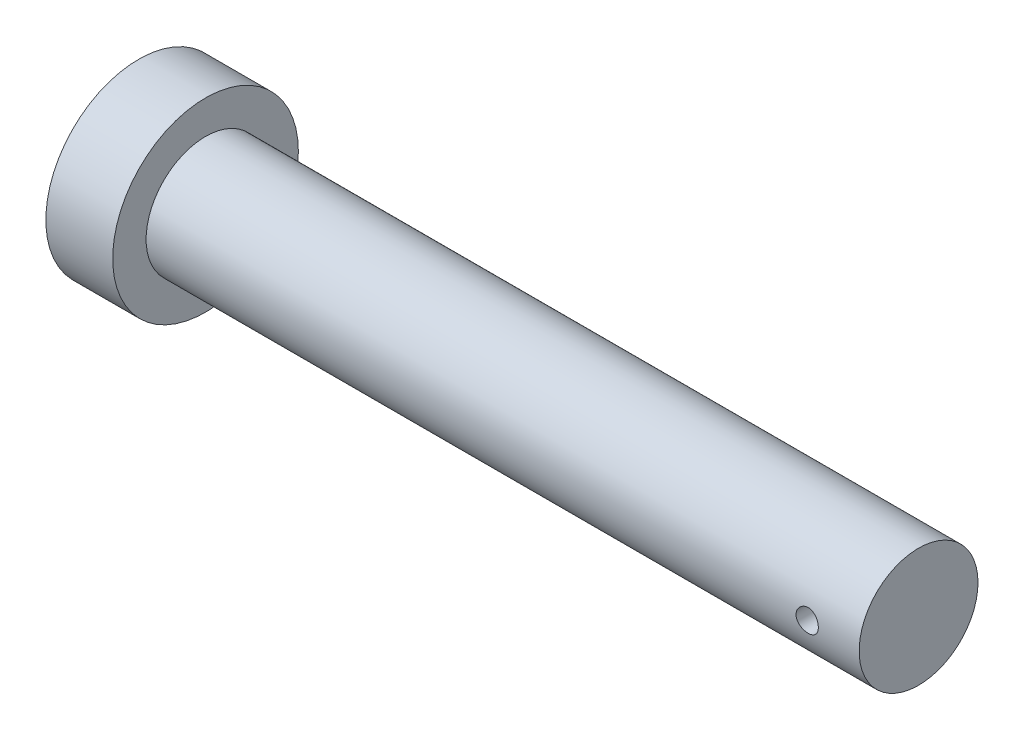
ISO-10303-21;
HEADER;
FILE_DESCRIPTION(('STEP AP214'),'2;1');
FILE_NAME('part.step','',(''),(''),'','','');
FILE_SCHEMA(('AUTOMOTIVE_DESIGN { 1 0 10303 214 1 1 1 1 }'));
ENDSEC;
DATA;
#1=APPLICATION_CONTEXT('core data for automotive mechanical design processes');
#2=APPLICATION_PROTOCOL_DEFINITION('international standard','automotive_design',2000,#1);
#3=PRODUCT_CONTEXT('',#1,'mechanical');
#4=PRODUCT('Part','Part','',(#3));
#5=PRODUCT_RELATED_PRODUCT_CATEGORY('part','',(#4));
#6=PRODUCT_DEFINITION_FORMATION('','',#4);
#7=PRODUCT_DEFINITION_CONTEXT('part definition',#1,'design');
#8=PRODUCT_DEFINITION('design','',#6,#7);
#9=PRODUCT_DEFINITION_SHAPE('','',#8);
#10=(LENGTH_UNIT() NAMED_UNIT(*) SI_UNIT(.MILLI.,.METRE.));
#11=(NAMED_UNIT(*) PLANE_ANGLE_UNIT() SI_UNIT($,.RADIAN.));
#12=(NAMED_UNIT(*) SI_UNIT($,.STERADIAN.) SOLID_ANGLE_UNIT());
#13=UNCERTAINTY_MEASURE_WITH_UNIT(LENGTH_MEASURE(1.E-05),#10,'distance_accuracy_value','');
#14=(GEOMETRIC_REPRESENTATION_CONTEXT(3) GLOBAL_UNCERTAINTY_ASSIGNED_CONTEXT((#13)) GLOBAL_UNIT_ASSIGNED_CONTEXT((#10,
#11,#12)) REPRESENTATION_CONTEXT('',''));
#15=CARTESIAN_POINT('',(0.,0.,0.));
#16=DIRECTION('',(0.,0.,1.));
#17=DIRECTION('',(1.,0.,0.));
#18=AXIS2_PLACEMENT_3D('',#15,#16,#17);
#19=CARTESIAN_POINT('',(9.,0.,0.));
#20=DIRECTION('',(1.,0.,0.));
#21=DIRECTION('',(0.,0.,-1.));
#22=AXIS2_PLACEMENT_3D('',#19,#20,#21);
#23=PLANE('',#22);
#24=CARTESIAN_POINT('',(9.,0.,0.));
#25=DIRECTION('',(1.,0.,0.));
#26=DIRECTION('',(0.,0.,-1.));
#27=AXIS2_PLACEMENT_3D('',#24,#25,#26);
#28=CIRCLE('',#27,12.5);
#29=CARTESIAN_POINT('',(9.,0.,-12.5));
#30=VERTEX_POINT('',#29);
#31=EDGE_CURVE('E48',#30,#30,#28,.T.);
#32=ORIENTED_EDGE('',*,*,#31,.T.);
#33=EDGE_LOOP('',(#32));
#34=FACE_BOUND('',#33,.T.);
#35=CARTESIAN_POINT('',(9.,0.,0.));
#36=DIRECTION('',(1.,0.,0.));
#37=DIRECTION('',(0.,0.,-1.));
#38=AXIS2_PLACEMENT_3D('',#35,#36,#37);
#39=CIRCLE('',#38,8.);
#40=CARTESIAN_POINT('',(9.,0.,-8.));
#41=VERTEX_POINT('',#40);
#42=EDGE_CURVE('E91',#41,#41,#39,.T.);
#43=ORIENTED_EDGE('',*,*,#42,.F.);
#44=EDGE_LOOP('',(#43));
#45=FACE_BOUND('',#44,.T.);
#46=ADVANCED_FACE('F35',(#34,#45),#23,.T.);
#47=CARTESIAN_POINT('',(9.,0.,0.));
#48=DIRECTION('',(-1.,0.,0.));
#49=DIRECTION('',(0.,0.,1.));
#50=AXIS2_PLACEMENT_3D('',#47,#48,#49);
#51=CYLINDRICAL_SURFACE('',#50,12.5);
#52=ORIENTED_EDGE('',*,*,#31,.F.);
#53=EDGE_LOOP('',(#52));
#54=FACE_BOUND('',#53,.T.);
#55=CARTESIAN_POINT('',(0.,0.,0.));
#56=DIRECTION('',(1.,0.,0.));
#57=DIRECTION('',(0.,0.,-1.));
#58=AXIS2_PLACEMENT_3D('',#55,#56,#57);
#59=CIRCLE('',#58,12.5);
#60=CARTESIAN_POINT('',(0.,0.,-12.5));
#61=VERTEX_POINT('',#60);
#62=EDGE_CURVE('E52',#61,#61,#59,.T.);
#63=ORIENTED_EDGE('',*,*,#62,.T.);
#64=EDGE_LOOP('',(#63));
#65=FACE_BOUND('',#64,.T.);
#66=ADVANCED_FACE('F37',(#54,#65),#51,.T.);
#67=CARTESIAN_POINT('',(0.,0.,0.));
#68=DIRECTION('',(1.,0.,0.));
#69=DIRECTION('',(0.,0.,-1.));
#70=AXIS2_PLACEMENT_3D('',#67,#68,#69);
#71=PLANE('',#70);
#72=ORIENTED_EDGE('',*,*,#62,.F.);
#73=EDGE_LOOP('',(#72));
#74=FACE_BOUND('',#73,.T.);
#75=ADVANCED_FACE('F73',(#74),#71,.F.);
#76=CARTESIAN_POINT('',(105.,0.,0.));
#77=DIRECTION('',(-1.,0.,0.));
#78=DIRECTION('',(0.,0.,1.));
#79=AXIS2_PLACEMENT_3D('',#76,#77,#78);
#80=CYLINDRICAL_SURFACE('',#79,8.);
#81=CARTESIAN_POINT('',(99.5,0.,-8.));
#82=CARTESIAN_POINT('',(99.4999968104117,0.0834717464654716,-7.99999848833852));
#83=CARTESIAN_POINT('',(99.4930089233806,0.1669849927301,-7.99868009921714));
#84=CARTESIAN_POINT('',(99.4652600048816,0.331658129841799,-7.9935478589052));
#85=CARTESIAN_POINT('',(99.4444873493602,0.412815974152226,-7.98973190166897));
#86=CARTESIAN_POINT('',(99.3898272987407,0.570372961851804,-7.98003138765458));
#87=CARTESIAN_POINT('',(99.3559517475475,0.646776330685349,-7.97414869946483));
#88=CARTESIAN_POINT('',(99.2760811230772,0.792807973094011,-7.96095710599783));
#89=CARTESIAN_POINT('',(99.2300870308552,0.862436794477324,-7.9536483161829));
#90=CARTESIAN_POINT('',(99.1267002319963,0.9937837159305,-7.93831336430504));
#91=CARTESIAN_POINT('',(99.0691905553299,1.05540895503183,-7.93028034856351));
#92=CARTESIAN_POINT('',(98.9446566909124,1.16819606135369,-7.9144531845865));
#93=CARTESIAN_POINT('',(98.8776318202307,1.21935717689241,-7.90665905354528));
#94=CARTESIAN_POINT('',(98.735313911636,1.31014998665793,-7.89212551245006));
#95=CARTESIAN_POINT('',(98.6599596296828,1.34968721969605,-7.88539493886182));
#96=CARTESIAN_POINT('',(98.5035310848232,1.41550524332283,-7.87384713211987));
#97=CARTESIAN_POINT('',(98.4224573158888,1.44178717713098,-7.86902973396962));
#98=CARTESIAN_POINT('',(98.2578847690856,1.480050535035,-7.8619226957455));
#99=CARTESIAN_POINT('',(98.1744249027965,1.49219390192039,-7.85960445366405));
#100=CARTESIAN_POINT('',(98.0066226151917,1.50233808095346,-7.85767197152761));
#101=CARTESIAN_POINT('',(97.9222802736977,1.50034016135374,-7.8580574889876));
#102=CARTESIAN_POINT('',(97.7562804747339,1.48238979602362,-7.86146292701753));
#103=CARTESIAN_POINT('',(97.6746022856998,1.46662149996045,-7.86444808147334));
#104=CARTESIAN_POINT('',(97.5150715802174,1.42186799396206,-7.87266183284666));
#105=CARTESIAN_POINT('',(97.4372192264907,1.39288222239499,-7.87789052509516));
#106=CARTESIAN_POINT('',(97.2870113209997,1.32233647179299,-7.89003855292589));
#107=CARTESIAN_POINT('',(97.2146915294192,1.28070213532455,-7.89696783823366));
#108=CARTESIAN_POINT('',(97.0779952714598,1.18609368930416,-7.91172971602918));
#109=CARTESIAN_POINT('',(97.0136196122852,1.13311842889265,-7.91956240015522));
#110=CARTESIAN_POINT('',(96.8935750443275,1.01633905685297,-7.93540001272164));
#111=CARTESIAN_POINT('',(96.8380593475482,0.952377436860676,-7.94340571024031));
#112=CARTESIAN_POINT('',(96.7385227593246,0.815968037098823,-7.95857386108318));
#113=CARTESIAN_POINT('',(96.6945019831296,0.743520172255769,-7.96573630595245));
#114=CARTESIAN_POINT('',(96.61918224613,0.592034988874669,-7.97842539677509));
#115=CARTESIAN_POINT('',(96.5878992208821,0.512989564446493,-7.98394999136289));
#116=CARTESIAN_POINT('',(96.5390979069078,0.350639115398694,-7.99272505402719));
#117=CARTESIAN_POINT('',(96.5215781559546,0.267334544277783,-7.99597576367994));
#118=CARTESIAN_POINT('',(96.5010139689817,0.100148652903381,-7.99980360641981));
#119=CARTESIAN_POINT('',(96.4977596084703,0.0162940126341309,-8.00041950912279));
#120=CARTESIAN_POINT('',(96.5052554795476,-0.150761248092187,-7.99901543598228));
#121=CARTESIAN_POINT('',(96.5160050230652,-0.233961900480388,-7.99699558964431));
#122=CARTESIAN_POINT('',(96.5510290351833,-0.396681573218219,-7.99057111500406));
#123=CARTESIAN_POINT('',(96.5751972825378,-0.476224261046066,-7.98618522374031));
#124=CARTESIAN_POINT('',(96.6362577067788,-0.630128631824634,-7.97551842212498));
#125=CARTESIAN_POINT('',(96.6731507475658,-0.704489962595103,-7.96923738311334));
#126=CARTESIAN_POINT('',(96.7590781281595,-0.846816671513214,-7.95538030357666));
#127=CARTESIAN_POINT('',(96.8082407385369,-0.914703277015124,-7.94779086174563));
#128=CARTESIAN_POINT('',(96.9171381373624,-1.04133832326455,-7.93219343489712));
#129=CARTESIAN_POINT('',(96.9768739130013,-1.10008590976087,-7.92418541084687));
#130=CARTESIAN_POINT('',(97.1061723189114,-1.20757295872048,-7.9085247569745));
#131=CARTESIAN_POINT('',(97.1758549081254,-1.25616916218577,-7.90087825860257));
#132=CARTESIAN_POINT('',(97.3225176245238,-1.34096675057787,-7.88692985578532));
#133=CARTESIAN_POINT('',(97.3994974803705,-1.37716859613924,-7.8806279013735));
#134=CARTESIAN_POINT('',(97.5582058672425,-1.43594673512823,-7.87013024209574));
#135=CARTESIAN_POINT('',(97.6399093795593,-1.45858868794786,-7.86592440436878));
#136=CARTESIAN_POINT('',(97.8060472225214,-1.48980679326235,-7.86007203802415));
#137=CARTESIAN_POINT('',(97.8904812439704,-1.49838453270708,-7.8584252206579));
#138=CARTESIAN_POINT('',(98.0582483314415,-1.50117762148354,-7.85789199803857));
#139=CARTESIAN_POINT('',(98.141577580957,-1.49561895003499,-7.85896215974293));
#140=CARTESIAN_POINT('',(98.3060914220453,-1.47079175378803,-7.86364600659998));
#141=CARTESIAN_POINT('',(98.3872760264274,-1.45152331089332,-7.86725967655747));
#142=CARTESIAN_POINT('',(98.5450744847955,-1.39991887583263,-7.8766050802318));
#143=CARTESIAN_POINT('',(98.6216965913457,-1.36760735397253,-7.88233284594965));
#144=CARTESIAN_POINT('',(98.7684682542408,-1.29085868912205,-7.8952638755184));
#145=CARTESIAN_POINT('',(98.8386173528448,-1.24642068948186,-7.90246724360119));
#146=CARTESIAN_POINT('',(98.9715836800423,-1.14589487339536,-7.91767266107745));
#147=CARTESIAN_POINT('',(99.0342754125671,-1.08964259864304,-7.92568505353043));
#148=CARTESIAN_POINT('',(99.1494051624645,-0.967427926742292,-7.94152833918735));
#149=CARTESIAN_POINT('',(99.2018408209801,-0.901463301891618,-7.94935919027328));
#150=CARTESIAN_POINT('',(99.2954109526271,-0.760984945071875,-7.96403975968049));
#151=CARTESIAN_POINT('',(99.3364394284906,-0.686399590640519,-7.97088000990561));
#152=CARTESIAN_POINT('',(99.4053176366051,-0.531290113653837,-7.98271619380687));
#153=CARTESIAN_POINT('',(99.4331797470469,-0.450771651705251,-7.98771385879037));
#154=CARTESIAN_POINT('',(99.4692773144187,-0.308347202825156,-7.99428290707632));
#155=CARTESIAN_POINT('',(99.4807786303128,-0.247273810251872,-7.99641470878206));
#156=CARTESIAN_POINT('',(99.4961410621164,-0.124141247115158,-7.9992737995401));
#157=CARTESIAN_POINT('',(99.5000023722559,-0.0620821016527094,-8.00000112429805));
#158=CARTESIAN_POINT('',(99.5,0.,-8.));
#159=B_SPLINE_CURVE_WITH_KNOTS('',3,(#81,#82,#83,#84,#85,#86,#87,#88,#89,#90,#91,#92,#93,#94,
#95,#96,#97,#98,#99,#100,#101,#102,#103,#104,#105,#106,#107,#108,#109,#110,#111,#112,#113,#114,
#115,#116,#117,#118,#119,#120,#121,#122,#123,#124,#125,#126,#127,#128,#129,#130,#131,#132,#133,
#134,#135,#136,#137,#138,#139,#140,#141,#142,#143,#144,#145,#146,#147,#148,#149,#150,#151,#152,
#153,#154,#155,#156,#157,#158),.UNSPECIFIED.,.T.,.F.,(4,2,2,2,2,2,2,2,2,2,2,2,2,2,2,2,2,2,2,2,2,
2,2,2,2,2,2,2,2,2,2,2,2,2,2,2,2,2,4),(0.,0.250188200964927,0.500587642535452,0.750761271230911,
1.00091465336891,1.2537511801363,1.50660586283616,1.76146190504357,2.01629596311948,
2.26818151445335,2.52004447587256,2.76859000612766,3.01714609846786,3.2671926262953,
3.5172645404986,3.77127768464076,4.02529337544947,4.27962588321698,4.53393136673745,
4.78448174076096,5.03501980464583,5.28360233907828,5.53220175338031,5.78351778017709,
6.03485728413098,6.28953436987299,6.54420198954945,6.79762627818559,7.05102196946512,
7.30039252231747,7.54976158541505,7.7986649620769,8.0475859265542,8.30023369966378,
8.55293951262253,8.80792048916312,9.06266126931171,9.24874344524407,9.43482089039539),.UNSPECIFIED.);
#160=CARTESIAN_POINT('',(99.5,0.,-8.));
#161=VERTEX_POINT('',#160);
#162=EDGE_CURVE('E39',#161,#161,#159,.T.);
#163=ORIENTED_EDGE('',*,*,#162,.T.);
#164=EDGE_LOOP('',(#163));
#165=FACE_BOUND('',#164,.T.);
#166=CARTESIAN_POINT('',(99.5,0.,8.00000000000001));
#167=CARTESIAN_POINT('',(99.4999968104117,-0.0834717464654715,7.99999848833853));
#168=CARTESIAN_POINT('',(99.4930089233806,-0.1669849927301,7.99868009921715));
#169=CARTESIAN_POINT('',(99.4652600048816,-0.331658129841799,7.9935478589052));
#170=CARTESIAN_POINT('',(99.4444873493602,-0.412815974152226,7.98973190166897));
#171=CARTESIAN_POINT('',(99.3898272987407,-0.570372961851804,7.98003138765458));
#172=CARTESIAN_POINT('',(99.3559517475475,-0.646776330685349,7.97414869946483));
#173=CARTESIAN_POINT('',(99.2760811230772,-0.792807973094011,7.96095710599783));
#174=CARTESIAN_POINT('',(99.2300870308552,-0.862436794477324,7.9536483161829));
#175=CARTESIAN_POINT('',(99.1267002319963,-0.993783715930499,7.93831336430504));
#176=CARTESIAN_POINT('',(99.0691905553299,-1.05540895503183,7.93028034856351));
#177=CARTESIAN_POINT('',(98.9446566909124,-1.16819606135369,7.9144531845865));
#178=CARTESIAN_POINT('',(98.8776318202307,-1.21935717689241,7.90665905354528));
#179=CARTESIAN_POINT('',(98.735313911636,-1.31014998665793,7.89212551245006));
#180=CARTESIAN_POINT('',(98.6599596296828,-1.34968721969605,7.88539493886182));
#181=CARTESIAN_POINT('',(98.5035310848232,-1.41550524332283,7.87384713211987));
#182=CARTESIAN_POINT('',(98.4224573158888,-1.44178717713098,7.86902973396962));
#183=CARTESIAN_POINT('',(98.2578847690856,-1.480050535035,7.8619226957455));
#184=CARTESIAN_POINT('',(98.1744249027965,-1.49219390192039,7.85960445366405));
#185=CARTESIAN_POINT('',(98.0066226151917,-1.50233808095346,7.85767197152761));
#186=CARTESIAN_POINT('',(97.9222802736977,-1.50034016135374,7.8580574889876));
#187=CARTESIAN_POINT('',(97.7562804747339,-1.48238979602362,7.86146292701753));
#188=CARTESIAN_POINT('',(97.6746022856998,-1.46662149996045,7.86444808147334));
#189=CARTESIAN_POINT('',(97.5150715802174,-1.42186799396206,7.87266183284666));
#190=CARTESIAN_POINT('',(97.4372192264907,-1.39288222239499,7.87789052509516));
#191=CARTESIAN_POINT('',(97.2870113209997,-1.32233647179299,7.89003855292589));
#192=CARTESIAN_POINT('',(97.2146915294192,-1.28070213532455,7.89696783823366));
#193=CARTESIAN_POINT('',(97.0779952714598,-1.18609368930416,7.91172971602918));
#194=CARTESIAN_POINT('',(97.0136196122852,-1.13311842889265,7.91956240015522));
#195=CARTESIAN_POINT('',(96.8935750443275,-1.01633905685297,7.93540001272164));
#196=CARTESIAN_POINT('',(96.8380593475482,-0.952377436860676,7.94340571024031));
#197=CARTESIAN_POINT('',(96.7385227593246,-0.815968037098823,7.95857386108318));
#198=CARTESIAN_POINT('',(96.6945019831296,-0.743520172255769,7.96573630595245));
#199=CARTESIAN_POINT('',(96.61918224613,-0.592034988874668,7.97842539677509));
#200=CARTESIAN_POINT('',(96.5878992208821,-0.512989564446493,7.98394999136289));
#201=CARTESIAN_POINT('',(96.5390979069078,-0.350639115398694,7.99272505402719));
#202=CARTESIAN_POINT('',(96.5215781559546,-0.267334544277783,7.99597576367994));
#203=CARTESIAN_POINT('',(96.5010139689817,-0.100148652903381,7.99980360641981));
#204=CARTESIAN_POINT('',(96.4977596084703,-0.0162940126341309,8.00041950912279));
#205=CARTESIAN_POINT('',(96.5052554795476,0.150761248092187,7.99901543598228));
#206=CARTESIAN_POINT('',(96.5160050230652,0.233961900480388,7.99699558964431));
#207=CARTESIAN_POINT('',(96.5510290351833,0.396681573218217,7.99057111500406));
#208=CARTESIAN_POINT('',(96.5751972825378,0.476224261046062,7.98618522374031));
#209=CARTESIAN_POINT('',(96.6362577067788,0.63012863182463,7.97551842212498));
#210=CARTESIAN_POINT('',(96.6731507475658,0.7044899625951,7.96923738311334));
#211=CARTESIAN_POINT('',(96.7590781281595,0.846816671513212,7.95538030357666));
#212=CARTESIAN_POINT('',(96.8082407385368,0.914703277015121,7.94779086174563));
#213=CARTESIAN_POINT('',(96.9171381373623,1.04133832326455,7.93219343489711));
#214=CARTESIAN_POINT('',(96.9768739130013,1.10008590976087,7.92418541084687));
#215=CARTESIAN_POINT('',(97.1061723189114,1.20757295872048,7.9085247569745));
#216=CARTESIAN_POINT('',(97.1758549081254,1.25616916218577,7.90087825860257));
#217=CARTESIAN_POINT('',(97.3225176245238,1.34096675057787,7.88692985578532));
#218=CARTESIAN_POINT('',(97.3994974803705,1.37716859613924,7.8806279013735));
#219=CARTESIAN_POINT('',(97.5582058672425,1.43594673512823,7.87013024209574));
#220=CARTESIAN_POINT('',(97.6399093795593,1.45858868794786,7.86592440436878));
#221=CARTESIAN_POINT('',(97.8060472225214,1.48980679326235,7.86007203802415));
#222=CARTESIAN_POINT('',(97.8904812439704,1.49838453270708,7.8584252206579));
#223=CARTESIAN_POINT('',(98.0582483314415,1.50117762148354,7.85789199803857));
#224=CARTESIAN_POINT('',(98.141577580957,1.49561895003499,7.85896215974293));
#225=CARTESIAN_POINT('',(98.3060914220453,1.47079175378803,7.86364600659998));
#226=CARTESIAN_POINT('',(98.3872760264274,1.45152331089332,7.86725967655747));
#227=CARTESIAN_POINT('',(98.5450744847955,1.39991887583263,7.8766050802318));
#228=CARTESIAN_POINT('',(98.6216965913457,1.36760735397253,7.88233284594965));
#229=CARTESIAN_POINT('',(98.7684682542408,1.29085868912205,7.8952638755184));
#230=CARTESIAN_POINT('',(98.8386173528448,1.24642068948186,7.90246724360119));
#231=CARTESIAN_POINT('',(98.9715836800423,1.14589487339536,7.91767266107745));
#232=CARTESIAN_POINT('',(99.0342754125671,1.08964259864304,7.92568505353043));
#233=CARTESIAN_POINT('',(99.1494051624645,0.967427926742292,7.94152833918735));
#234=CARTESIAN_POINT('',(99.2018408209801,0.901463301891618,7.94935919027328));
#235=CARTESIAN_POINT('',(99.2954109526271,0.760984945071875,7.96403975968049));
#236=CARTESIAN_POINT('',(99.3364394284906,0.686399590640519,7.97088000990561));
#237=CARTESIAN_POINT('',(99.4053176366051,0.531290113653837,7.98271619380687));
#238=CARTESIAN_POINT('',(99.4331797470469,0.450771651705251,7.98771385879037));
#239=CARTESIAN_POINT('',(99.4692773144187,0.308347202825156,7.99428290707632));
#240=CARTESIAN_POINT('',(99.4807786303128,0.247273810251872,7.99641470878206));
#241=CARTESIAN_POINT('',(99.4961410621164,0.124141247115158,7.9992737995401));
#242=CARTESIAN_POINT('',(99.5000023722559,0.0620821016527094,8.00000112429806));
#243=CARTESIAN_POINT('',(99.5,0.,8.00000000000001));
#244=B_SPLINE_CURVE_WITH_KNOTS('',3,(#166,#167,#168,#169,#170,#171,#172,#173,#174,#175,#176,
#177,#178,#179,#180,#181,#182,#183,#184,#185,#186,#187,#188,#189,#190,#191,#192,#193,#194,#195,
#196,#197,#198,#199,#200,#201,#202,#203,#204,#205,#206,#207,#208,#209,#210,#211,#212,#213,#214,
#215,#216,#217,#218,#219,#220,#221,#222,#223,#224,#225,#226,#227,#228,#229,#230,#231,#232,#233,
#234,#235,#236,#237,#238,#239,#240,#241,#242,#243),.UNSPECIFIED.,.T.,.F.,(4,2,2,2,2,2,2,2,2,2,2,
2,2,2,2,2,2,2,2,2,2,2,2,2,2,2,2,2,2,2,2,2,2,2,2,2,2,2,4),(0.,0.250188200964927,
0.500587642535451,0.750761271230911,1.00091465336891,1.2537511801363,1.50660586283616,
1.76146190504357,2.01629596311948,2.26818151445335,2.52004447587256,2.76859000612766,
3.01714609846786,3.2671926262953,3.51726454049859,3.77127768464076,4.02529337544947,
4.27962588321698,4.53393136673745,4.78448174076096,5.03501980464583,5.28360233907827,
5.53220175338031,5.78351778017707,6.03485728413098,6.28953436987299,6.54420198954945,
6.79762627818559,7.05102196946512,7.30039252231747,7.54976158541504,7.7986649620769,
8.0475859265542,8.30023369966378,8.55293951262253,8.80792048916312,9.06266126931171,
9.24874344524407,9.43482089039538),.UNSPECIFIED.);
#245=CARTESIAN_POINT('',(99.5,0.,8.00000000000001));
#246=VERTEX_POINT('',#245);
#247=EDGE_CURVE('E10',#246,#246,#244,.T.);
#248=ORIENTED_EDGE('',*,*,#247,.T.);
#249=EDGE_LOOP('',(#248));
#250=FACE_BOUND('',#249,.T.);
#251=CARTESIAN_POINT('',(105.,0.,0.));
#252=DIRECTION('',(1.,0.,0.));
#253=DIRECTION('',(0.,0.,-1.));
#254=AXIS2_PLACEMENT_3D('',#251,#252,#253);
#255=CIRCLE('',#254,8.);
#256=CARTESIAN_POINT('',(105.,0.,-8.));
#257=VERTEX_POINT('',#256);
#258=EDGE_CURVE('E90',#257,#257,#255,.T.);
#259=ORIENTED_EDGE('',*,*,#258,.F.);
#260=EDGE_LOOP('',(#259));
#261=FACE_BOUND('',#260,.T.);
#262=ORIENTED_EDGE('',*,*,#42,.T.);
#263=EDGE_LOOP('',(#262));
#264=FACE_BOUND('',#263,.T.);
#265=ADVANCED_FACE('F58',(#165,#250,#261,#264),#80,.T.);
#266=CARTESIAN_POINT('',(105.,0.,0.));
#267=DIRECTION('',(1.,0.,0.));
#268=DIRECTION('',(0.,0.,-1.));
#269=AXIS2_PLACEMENT_3D('',#266,#267,#268);
#270=PLANE('',#269);
#271=ORIENTED_EDGE('',*,*,#258,.T.);
#272=EDGE_LOOP('',(#271));
#273=FACE_BOUND('',#272,.T.);
#274=ADVANCED_FACE('F65',(#273),#270,.T.);
#275=CARTESIAN_POINT('',(98.,0.,-88.));
#276=DIRECTION('',(0.,0.,1.));
#277=DIRECTION('',(1.,0.,0.));
#278=AXIS2_PLACEMENT_3D('',#275,#276,#277);
#279=CYLINDRICAL_SURFACE('',#278,1.5);
#280=ORIENTED_EDGE('',*,*,#162,.F.);
#281=EDGE_LOOP('',(#280));
#282=FACE_BOUND('',#281,.T.);
#283=ORIENTED_EDGE('',*,*,#247,.F.);
#284=EDGE_LOOP('',(#283));
#285=FACE_BOUND('',#284,.T.);
#286=ADVANCED_FACE('F62',(#282,#285),#279,.F.);
#287=CLOSED_SHELL('',(#46,#66,#75,#265,#274,#286));
#288=MANIFOLD_SOLID_BREP('B2',#287);
#289=ADVANCED_BREP_SHAPE_REPRESENTATION('',(#18,#288),#14);
#290=SHAPE_DEFINITION_REPRESENTATION(#9,#289);
ENDSEC;
END-ISO-10303-21;
